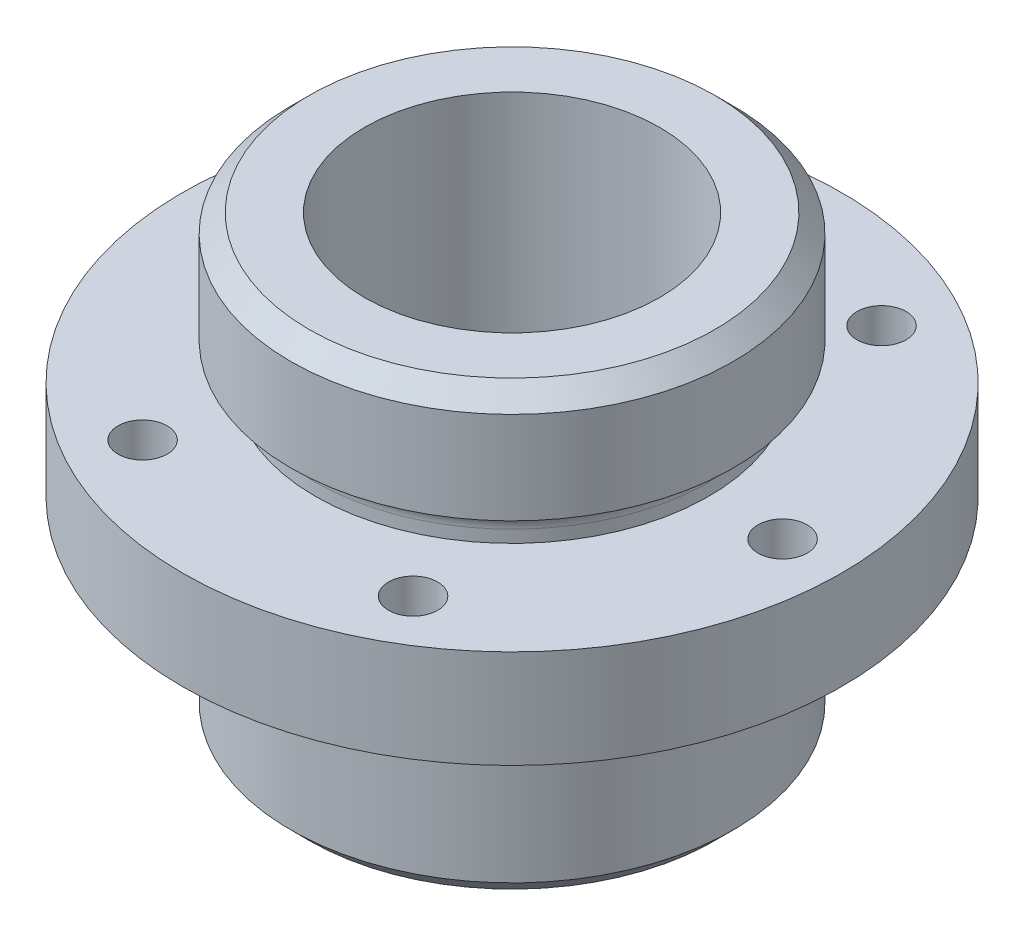
ISO-10303-21;
HEADER;
FILE_DESCRIPTION(('STEP AP214'),'2;1');
FILE_NAME('part.step','',(''),(''),'','','');
FILE_SCHEMA(('AUTOMOTIVE_DESIGN { 1 0 10303 214 1 1 1 1 }'));
ENDSEC;
DATA;
#1=APPLICATION_CONTEXT('core data for automotive mechanical design processes');
#2=APPLICATION_PROTOCOL_DEFINITION('international standard','automotive_design',2000,#1);
#3=PRODUCT_CONTEXT('',#1,'mechanical');
#4=PRODUCT('Part','Part','',(#3));
#5=PRODUCT_RELATED_PRODUCT_CATEGORY('part','',(#4));
#6=PRODUCT_DEFINITION_FORMATION('','',#4);
#7=PRODUCT_DEFINITION_CONTEXT('part definition',#1,'design');
#8=PRODUCT_DEFINITION('design','',#6,#7);
#9=PRODUCT_DEFINITION_SHAPE('','',#8);
#10=(LENGTH_UNIT() NAMED_UNIT(*) SI_UNIT(.MILLI.,.METRE.));
#11=(NAMED_UNIT(*) PLANE_ANGLE_UNIT() SI_UNIT($,.RADIAN.));
#12=(NAMED_UNIT(*) SI_UNIT($,.STERADIAN.) SOLID_ANGLE_UNIT());
#13=UNCERTAINTY_MEASURE_WITH_UNIT(LENGTH_MEASURE(1.E-05),#10,'distance_accuracy_value','');
#14=(GEOMETRIC_REPRESENTATION_CONTEXT(3) GLOBAL_UNCERTAINTY_ASSIGNED_CONTEXT((#13)) GLOBAL_UNIT_ASSIGNED_CONTEXT((#10,
#11,#12)) REPRESENTATION_CONTEXT('',''));
#15=CARTESIAN_POINT('',(0.,0.,0.));
#16=DIRECTION('',(0.,0.,1.));
#17=DIRECTION('',(1.,0.,0.));
#18=AXIS2_PLACEMENT_3D('',#15,#16,#17);
#19=CARTESIAN_POINT('',(0.,16.,0.));
#20=DIRECTION('',(0.,1.,0.));
#21=DIRECTION('',(0.,0.,1.));
#22=AXIS2_PLACEMENT_3D('',#19,#20,#21);
#23=PLANE('',#22);
#24=CARTESIAN_POINT('',(0.,16.,0.));
#25=DIRECTION('',(0.,1.,0.));
#26=DIRECTION('',(0.,0.,1.));
#27=AXIS2_PLACEMENT_3D('',#24,#25,#26);
#28=CIRCLE('',#27,32.);
#29=CARTESIAN_POINT('',(0.,16.,32.));
#30=VERTEX_POINT('',#29);
#31=EDGE_CURVE('E78',#30,#30,#28,.T.);
#32=ORIENTED_EDGE('',*,*,#31,.F.);
#33=EDGE_LOOP('',(#32));
#34=FACE_BOUND('',#33,.T.);
#35=CARTESIAN_POINT('',(22.,16.,38.1051177665153));
#36=DIRECTION('',(0.,1.,0.));
#37=DIRECTION('',(0.,0.,1.));
#38=AXIS2_PLACEMENT_3D('',#35,#36,#37);
#39=CIRCLE('',#38,3.99999999999999);
#40=CARTESIAN_POINT('',(22.,16.,42.1051177665153));
#41=VERTEX_POINT('',#40);
#42=EDGE_CURVE('E116',#41,#41,#39,.T.);
#43=ORIENTED_EDGE('',*,*,#42,.F.);
#44=EDGE_LOOP('',(#43));
#45=FACE_BOUND('',#44,.T.);
#46=CARTESIAN_POINT('',(22.,16.,-38.1051177665153));
#47=DIRECTION('',(0.,1.,0.));
#48=DIRECTION('',(0.,0.,1.));
#49=AXIS2_PLACEMENT_3D('',#46,#47,#48);
#50=CIRCLE('',#49,3.99999999999999);
#51=CARTESIAN_POINT('',(22.,16.,-34.1051177665153));
#52=VERTEX_POINT('',#51);
#53=EDGE_CURVE('E100',#52,#52,#50,.T.);
#54=ORIENTED_EDGE('',*,*,#53,.F.);
#55=EDGE_LOOP('',(#54));
#56=FACE_BOUND('',#55,.T.);
#57=CARTESIAN_POINT('',(-44.,16.,0.));
#58=DIRECTION('',(0.,1.,0.));
#59=DIRECTION('',(0.,0.,1.));
#60=AXIS2_PLACEMENT_3D('',#57,#58,#59);
#61=CIRCLE('',#60,4.);
#62=CARTESIAN_POINT('',(-44.,16.,4.));
#63=VERTEX_POINT('',#62);
#64=EDGE_CURVE('E84',#63,#63,#61,.T.);
#65=ORIENTED_EDGE('',*,*,#64,.F.);
#66=EDGE_LOOP('',(#65));
#67=FACE_BOUND('',#66,.T.);
#68=CARTESIAN_POINT('',(0.,16.,0.));
#69=DIRECTION('',(0.,1.,0.));
#70=DIRECTION('',(0.,0.,1.));
#71=AXIS2_PLACEMENT_3D('',#68,#69,#70);
#72=CIRCLE('',#71,53.6143984930028);
#73=CARTESIAN_POINT('',(0.,16.,53.6143984930028));
#74=VERTEX_POINT('',#73);
#75=EDGE_CURVE('E83',#74,#74,#72,.T.);
#76=ORIENTED_EDGE('',*,*,#75,.T.);
#77=EDGE_LOOP('',(#76));
#78=FACE_BOUND('',#77,.T.);
#79=CARTESIAN_POINT('',(-22.,16.,-38.1051177665153));
#80=DIRECTION('',(0.,1.,0.));
#81=DIRECTION('',(0.,0.,1.));
#82=AXIS2_PLACEMENT_3D('',#79,#80,#81);
#83=CIRCLE('',#82,3.99999999999999);
#84=CARTESIAN_POINT('',(-22.,16.,-34.1051177665153));
#85=VERTEX_POINT('',#84);
#86=EDGE_CURVE('E92',#85,#85,#83,.T.);
#87=ORIENTED_EDGE('',*,*,#86,.F.);
#88=EDGE_LOOP('',(#87));
#89=FACE_BOUND('',#88,.T.);
#90=CARTESIAN_POINT('',(44.,16.,0.));
#91=DIRECTION('',(0.,1.,0.));
#92=DIRECTION('',(0.,0.,1.));
#93=AXIS2_PLACEMENT_3D('',#90,#91,#92);
#94=CIRCLE('',#93,4.);
#95=CARTESIAN_POINT('',(44.,16.,3.99999999999999));
#96=VERTEX_POINT('',#95);
#97=EDGE_CURVE('E108',#96,#96,#94,.T.);
#98=ORIENTED_EDGE('',*,*,#97,.F.);
#99=EDGE_LOOP('',(#98));
#100=FACE_BOUND('',#99,.T.);
#101=CARTESIAN_POINT('',(-22.,16.,38.1051177665153));
#102=DIRECTION('',(0.,1.,0.));
#103=DIRECTION('',(0.,0.,1.));
#104=AXIS2_PLACEMENT_3D('',#101,#102,#103);
#105=CIRCLE('',#104,3.99999999999999);
#106=CARTESIAN_POINT('',(-22.,16.,42.1051177665153));
#107=VERTEX_POINT('',#106);
#108=EDGE_CURVE('E124',#107,#107,#105,.T.);
#109=ORIENTED_EDGE('',*,*,#108,.F.);
#110=EDGE_LOOP('',(#109));
#111=FACE_BOUND('',#110,.T.);
#112=ADVANCED_FACE('F41',(#34,#45,#56,#67,#78,#89,#100,#111),#23,.T.);
#113=CARTESIAN_POINT('',(0.,0.,0.));
#114=DIRECTION('',(0.,1.,0.));
#115=DIRECTION('',(0.,0.,1.));
#116=AXIS2_PLACEMENT_3D('',#113,#114,#115);
#117=PLANE('',#116);
#118=CARTESIAN_POINT('',(0.,0.,0.));
#119=DIRECTION('',(0.,1.,0.));
#120=DIRECTION('',(0.,0.,1.));
#121=AXIS2_PLACEMENT_3D('',#118,#119,#120);
#122=CIRCLE('',#121,32.);
#123=CARTESIAN_POINT('',(0.,0.,32.));
#124=VERTEX_POINT('',#123);
#125=EDGE_CURVE('E74',#124,#124,#122,.F.);
#126=ORIENTED_EDGE('',*,*,#125,.F.);
#127=EDGE_LOOP('',(#126));
#128=FACE_BOUND('',#127,.T.);
#129=CARTESIAN_POINT('',(0.,0.,0.));
#130=DIRECTION('',(0.,1.,0.));
#131=DIRECTION('',(0.,0.,1.));
#132=AXIS2_PLACEMENT_3D('',#129,#130,#131);
#133=CIRCLE('',#132,53.6143984930028);
#134=CARTESIAN_POINT('',(0.,0.,53.6143984930028));
#135=VERTEX_POINT('',#134);
#136=EDGE_CURVE('E79',#135,#135,#133,.T.);
#137=ORIENTED_EDGE('',*,*,#136,.F.);
#138=EDGE_LOOP('',(#137));
#139=FACE_BOUND('',#138,.T.);
#140=CARTESIAN_POINT('',(-44.,0.,0.));
#141=DIRECTION('',(0.,1.,0.));
#142=DIRECTION('',(0.,0.,1.));
#143=AXIS2_PLACEMENT_3D('',#140,#141,#142);
#144=CIRCLE('',#143,4.);
#145=CARTESIAN_POINT('',(-44.,0.,4.));
#146=VERTEX_POINT('',#145);
#147=EDGE_CURVE('E88',#146,#146,#144,.T.);
#148=ORIENTED_EDGE('',*,*,#147,.T.);
#149=EDGE_LOOP('',(#148));
#150=FACE_BOUND('',#149,.T.);
#151=CARTESIAN_POINT('',(-22.,0.,-38.1051177665153));
#152=DIRECTION('',(0.,1.,0.));
#153=DIRECTION('',(0.,0.,1.));
#154=AXIS2_PLACEMENT_3D('',#151,#152,#153);
#155=CIRCLE('',#154,3.99999999999999);
#156=CARTESIAN_POINT('',(-22.,0.,-34.1051177665153));
#157=VERTEX_POINT('',#156);
#158=EDGE_CURVE('E96',#157,#157,#155,.T.);
#159=ORIENTED_EDGE('',*,*,#158,.T.);
#160=EDGE_LOOP('',(#159));
#161=FACE_BOUND('',#160,.T.);
#162=CARTESIAN_POINT('',(22.,0.,-38.1051177665153));
#163=DIRECTION('',(0.,1.,0.));
#164=DIRECTION('',(0.,0.,1.));
#165=AXIS2_PLACEMENT_3D('',#162,#163,#164);
#166=CIRCLE('',#165,3.99999999999999);
#167=CARTESIAN_POINT('',(22.,0.,-34.1051177665153));
#168=VERTEX_POINT('',#167);
#169=EDGE_CURVE('E104',#168,#168,#166,.T.);
#170=ORIENTED_EDGE('',*,*,#169,.T.);
#171=EDGE_LOOP('',(#170));
#172=FACE_BOUND('',#171,.T.);
#173=CARTESIAN_POINT('',(44.,0.,0.));
#174=DIRECTION('',(0.,1.,0.));
#175=DIRECTION('',(0.,0.,1.));
#176=AXIS2_PLACEMENT_3D('',#173,#174,#175);
#177=CIRCLE('',#176,4.);
#178=CARTESIAN_POINT('',(44.,0.,3.99999999999999));
#179=VERTEX_POINT('',#178);
#180=EDGE_CURVE('E112',#179,#179,#177,.T.);
#181=ORIENTED_EDGE('',*,*,#180,.T.);
#182=EDGE_LOOP('',(#181));
#183=FACE_BOUND('',#182,.T.);
#184=CARTESIAN_POINT('',(22.,0.,38.1051177665153));
#185=DIRECTION('',(0.,1.,0.));
#186=DIRECTION('',(0.,0.,1.));
#187=AXIS2_PLACEMENT_3D('',#184,#185,#186);
#188=CIRCLE('',#187,3.99999999999999);
#189=CARTESIAN_POINT('',(22.,0.,42.1051177665153));
#190=VERTEX_POINT('',#189);
#191=EDGE_CURVE('E120',#190,#190,#188,.T.);
#192=ORIENTED_EDGE('',*,*,#191,.T.);
#193=EDGE_LOOP('',(#192));
#194=FACE_BOUND('',#193,.T.);
#195=CARTESIAN_POINT('',(-22.,0.,38.1051177665153));
#196=DIRECTION('',(0.,1.,0.));
#197=DIRECTION('',(0.,0.,1.));
#198=AXIS2_PLACEMENT_3D('',#195,#196,#197);
#199=CIRCLE('',#198,3.99999999999999);
#200=CARTESIAN_POINT('',(-22.,0.,42.1051177665153));
#201=VERTEX_POINT('',#200);
#202=EDGE_CURVE('E128',#201,#201,#199,.T.);
#203=ORIENTED_EDGE('',*,*,#202,.T.);
#204=EDGE_LOOP('',(#203));
#205=FACE_BOUND('',#204,.T.);
#206=ADVANCED_FACE('F173',(#128,#139,#150,#161,#172,#183,#194,#205),#117,.F.);
#207=CARTESIAN_POINT('',(0.,16.,0.));
#208=DIRECTION('',(0.,-1.,0.));
#209=DIRECTION('',(0.,0.,-1.));
#210=AXIS2_PLACEMENT_3D('',#207,#208,#209);
#211=CYLINDRICAL_SURFACE('',#210,53.6143984930028);
#212=ORIENTED_EDGE('',*,*,#75,.F.);
#213=EDGE_LOOP('',(#212));
#214=FACE_BOUND('',#213,.T.);
#215=ORIENTED_EDGE('',*,*,#136,.T.);
#216=EDGE_LOOP('',(#215));
#217=FACE_BOUND('',#216,.T.);
#218=ADVANCED_FACE('F179',(#214,#217),#211,.T.);
#219=CARTESIAN_POINT('',(-44.,16.,0.));
#220=DIRECTION('',(0.,-1.,0.));
#221=DIRECTION('',(0.,0.,-1.));
#222=AXIS2_PLACEMENT_3D('',#219,#220,#221);
#223=CYLINDRICAL_SURFACE('',#222,4.);
#224=ORIENTED_EDGE('',*,*,#64,.T.);
#225=EDGE_LOOP('',(#224));
#226=FACE_BOUND('',#225,.T.);
#227=ORIENTED_EDGE('',*,*,#147,.F.);
#228=EDGE_LOOP('',(#227));
#229=FACE_BOUND('',#228,.T.);
#230=ADVANCED_FACE('F185',(#226,#229),#223,.F.);
#231=CARTESIAN_POINT('',(-22.,16.,-38.1051177665153));
#232=DIRECTION('',(0.,-1.,0.));
#233=DIRECTION('',(0.,0.,-1.));
#234=AXIS2_PLACEMENT_3D('',#231,#232,#233);
#235=CYLINDRICAL_SURFACE('',#234,3.99999999999999);
#236=ORIENTED_EDGE('',*,*,#86,.T.);
#237=EDGE_LOOP('',(#236));
#238=FACE_BOUND('',#237,.T.);
#239=ORIENTED_EDGE('',*,*,#158,.F.);
#240=EDGE_LOOP('',(#239));
#241=FACE_BOUND('',#240,.T.);
#242=ADVANCED_FACE('F339',(#238,#241),#235,.F.);
#243=CARTESIAN_POINT('',(22.,16.,-38.1051177665153));
#244=DIRECTION('',(0.,-1.,0.));
#245=DIRECTION('',(0.,0.,-1.));
#246=AXIS2_PLACEMENT_3D('',#243,#244,#245);
#247=CYLINDRICAL_SURFACE('',#246,3.99999999999999);
#248=ORIENTED_EDGE('',*,*,#53,.T.);
#249=EDGE_LOOP('',(#248));
#250=FACE_BOUND('',#249,.T.);
#251=ORIENTED_EDGE('',*,*,#169,.F.);
#252=EDGE_LOOP('',(#251));
#253=FACE_BOUND('',#252,.T.);
#254=ADVANCED_FACE('F328',(#250,#253),#247,.F.);
#255=CARTESIAN_POINT('',(44.,16.,0.));
#256=DIRECTION('',(0.,-1.,0.));
#257=DIRECTION('',(0.,0.,-1.));
#258=AXIS2_PLACEMENT_3D('',#255,#256,#257);
#259=CYLINDRICAL_SURFACE('',#258,4.);
#260=ORIENTED_EDGE('',*,*,#97,.T.);
#261=EDGE_LOOP('',(#260));
#262=FACE_BOUND('',#261,.T.);
#263=ORIENTED_EDGE('',*,*,#180,.F.);
#264=EDGE_LOOP('',(#263));
#265=FACE_BOUND('',#264,.T.);
#266=ADVANCED_FACE('F317',(#262,#265),#259,.F.);
#267=CARTESIAN_POINT('',(22.,16.,38.1051177665153));
#268=DIRECTION('',(0.,-1.,0.));
#269=DIRECTION('',(0.,0.,-1.));
#270=AXIS2_PLACEMENT_3D('',#267,#268,#269);
#271=CYLINDRICAL_SURFACE('',#270,3.99999999999999);
#272=ORIENTED_EDGE('',*,*,#42,.T.);
#273=EDGE_LOOP('',(#272));
#274=FACE_BOUND('',#273,.T.);
#275=ORIENTED_EDGE('',*,*,#191,.F.);
#276=EDGE_LOOP('',(#275));
#277=FACE_BOUND('',#276,.T.);
#278=ADVANCED_FACE('F305',(#274,#277),#271,.F.);
#279=CARTESIAN_POINT('',(-22.,16.,38.1051177665153));
#280=DIRECTION('',(0.,-1.,0.));
#281=DIRECTION('',(0.,0.,-1.));
#282=AXIS2_PLACEMENT_3D('',#279,#280,#281);
#283=CYLINDRICAL_SURFACE('',#282,3.99999999999999);
#284=ORIENTED_EDGE('',*,*,#108,.T.);
#285=EDGE_LOOP('',(#284));
#286=FACE_BOUND('',#285,.T.);
#287=ORIENTED_EDGE('',*,*,#202,.F.);
#288=EDGE_LOOP('',(#287));
#289=FACE_BOUND('',#288,.T.);
#290=ADVANCED_FACE('F282',(#286,#289),#283,.F.);
#291=CARTESIAN_POINT('',(0.,22.,0.));
#292=DIRECTION('',(0.,-1.,0.));
#293=DIRECTION('',(0.,0.,-1.));
#294=AXIS2_PLACEMENT_3D('',#291,#292,#293);
#295=CYLINDRICAL_SURFACE('',#294,32.);
#296=CARTESIAN_POINT('',(0.,18.,0.));
#297=DIRECTION('',(0.,1.,0.));
#298=DIRECTION('',(0.,0.,1.));
#299=AXIS2_PLACEMENT_3D('',#296,#297,#298);
#300=CIRCLE('',#299,32.);
#301=CARTESIAN_POINT('',(0.,18.,32.));
#302=VERTEX_POINT('',#301);
#303=EDGE_CURVE('E66',#302,#302,#300,.F.);
#304=ORIENTED_EDGE('',*,*,#303,.T.);
#305=EDGE_LOOP('',(#304));
#306=FACE_BOUND('',#305,.T.);
#307=ORIENTED_EDGE('',*,*,#31,.T.);
#308=EDGE_LOOP('',(#307));
#309=FACE_BOUND('',#308,.T.);
#310=ADVANCED_FACE('F170',(#306,#309),#295,.T.);
#311=CARTESIAN_POINT('',(0.,40.,0.));
#312=DIRECTION('',(0.,-1.,0.));
#313=DIRECTION('',(0.,0.,-1.));
#314=AXIS2_PLACEMENT_3D('',#311,#312,#313);
#315=CYLINDRICAL_SURFACE('',#314,36.);
#316=CARTESIAN_POINT('',(0.,37.,0.));
#317=DIRECTION('',(0.,1.,0.));
#318=DIRECTION('',(0.,0.,1.));
#319=AXIS2_PLACEMENT_3D('',#316,#317,#318);
#320=CIRCLE('',#319,36.);
#321=CARTESIAN_POINT('',(0.,37.,36.));
#322=VERTEX_POINT('',#321);
#323=EDGE_CURVE('E10',#322,#322,#320,.F.);
#324=ORIENTED_EDGE('',*,*,#323,.T.);
#325=EDGE_LOOP('',(#324));
#326=FACE_BOUND('',#325,.T.);
#327=CARTESIAN_POINT('',(0.,22.,0.));
#328=DIRECTION('',(0.,1.,0.));
#329=DIRECTION('',(0.,0.,1.));
#330=AXIS2_PLACEMENT_3D('',#327,#328,#329);
#331=CIRCLE('',#330,36.);
#332=CARTESIAN_POINT('',(0.,22.,36.));
#333=VERTEX_POINT('',#332);
#334=EDGE_CURVE('E132',#333,#333,#331,.T.);
#335=ORIENTED_EDGE('',*,*,#334,.T.);
#336=EDGE_LOOP('',(#335));
#337=FACE_BOUND('',#336,.T.);
#338=ADVANCED_FACE('F161',(#326,#337),#315,.T.);
#339=CARTESIAN_POINT('',(0.,40.,0.));
#340=DIRECTION('',(0.,1.,0.));
#341=DIRECTION('',(0.,0.,1.));
#342=AXIS2_PLACEMENT_3D('',#339,#340,#341);
#343=PLANE('',#342);
#344=CARTESIAN_POINT('',(0.,40.,0.));
#345=DIRECTION('',(0.,1.,0.));
#346=DIRECTION('',(0.,0.,1.));
#347=AXIS2_PLACEMENT_3D('',#344,#345,#346);
#348=CIRCLE('',#347,24.);
#349=CARTESIAN_POINT('',(0.,40.,24.));
#350=VERTEX_POINT('',#349);
#351=EDGE_CURVE('E150',#350,#350,#348,.T.);
#352=ORIENTED_EDGE('',*,*,#351,.F.);
#353=EDGE_LOOP('',(#352));
#354=FACE_BOUND('',#353,.T.);
#355=CARTESIAN_POINT('',(0.,40.,0.));
#356=DIRECTION('',(0.,1.,0.));
#357=DIRECTION('',(0.,0.,1.));
#358=AXIS2_PLACEMENT_3D('',#355,#356,#357);
#359=CIRCLE('',#358,33.);
#360=CARTESIAN_POINT('',(0.,40.,33.));
#361=VERTEX_POINT('',#360);
#362=EDGE_CURVE('E50',#361,#361,#359,.T.);
#363=ORIENTED_EDGE('',*,*,#362,.T.);
#364=EDGE_LOOP('',(#363));
#365=FACE_BOUND('',#364,.T.);
#366=ADVANCED_FACE('F158',(#354,#365),#343,.T.);
#367=CARTESIAN_POINT('',(0.,-8.,0.));
#368=DIRECTION('',(0.,1.,0.));
#369=DIRECTION('',(0.,0.,1.));
#370=AXIS2_PLACEMENT_3D('',#367,#368,#369);
#371=CYLINDRICAL_SURFACE('',#370,32.);
#372=CARTESIAN_POINT('',(0.,-4.,0.));
#373=DIRECTION('',(0.,-1.,0.));
#374=DIRECTION('',(0.,0.,-1.));
#375=AXIS2_PLACEMENT_3D('',#372,#373,#374);
#376=CIRCLE('',#375,32.);
#377=CARTESIAN_POINT('',(0.,-4.,-32.));
#378=VERTEX_POINT('',#377);
#379=EDGE_CURVE('E70',#378,#378,#376,.F.);
#380=ORIENTED_EDGE('',*,*,#379,.T.);
#381=EDGE_LOOP('',(#380));
#382=FACE_BOUND('',#381,.T.);
#383=ORIENTED_EDGE('',*,*,#125,.T.);
#384=EDGE_LOOP('',(#383));
#385=FACE_BOUND('',#384,.T.);
#386=ADVANCED_FACE('F160',(#382,#385),#371,.T.);
#387=CARTESIAN_POINT('',(0.,-32.,0.));
#388=DIRECTION('',(0.,1.,0.));
#389=DIRECTION('',(0.,0.,1.));
#390=AXIS2_PLACEMENT_3D('',#387,#388,#389);
#391=CYLINDRICAL_SURFACE('',#390,36.);
#392=CARTESIAN_POINT('',(0.,-29.,0.));
#393=DIRECTION('',(0.,-1.,0.));
#394=DIRECTION('',(0.,0.,-1.));
#395=AXIS2_PLACEMENT_3D('',#392,#393,#394);
#396=CIRCLE('',#395,36.);
#397=CARTESIAN_POINT('',(0.,-29.,-36.));
#398=VERTEX_POINT('',#397);
#399=EDGE_CURVE('E55',#398,#398,#396,.F.);
#400=ORIENTED_EDGE('',*,*,#399,.T.);
#401=EDGE_LOOP('',(#400));
#402=FACE_BOUND('',#401,.T.);
#403=CARTESIAN_POINT('',(0.,-8.,0.));
#404=DIRECTION('',(0.,-1.,0.));
#405=DIRECTION('',(0.,0.,-1.));
#406=AXIS2_PLACEMENT_3D('',#403,#404,#405);
#407=CIRCLE('',#406,36.);
#408=CARTESIAN_POINT('',(0.,-8.,-36.));
#409=VERTEX_POINT('',#408);
#410=EDGE_CURVE('E142',#409,#409,#407,.T.);
#411=ORIENTED_EDGE('',*,*,#410,.T.);
#412=EDGE_LOOP('',(#411));
#413=FACE_BOUND('',#412,.T.);
#414=ADVANCED_FACE('F167',(#402,#413),#391,.T.);
#415=CARTESIAN_POINT('',(0.,-32.,0.));
#416=DIRECTION('',(0.,-1.,0.));
#417=DIRECTION('',(0.,0.,-1.));
#418=AXIS2_PLACEMENT_3D('',#415,#416,#417);
#419=PLANE('',#418);
#420=CARTESIAN_POINT('',(0.,-32.,0.));
#421=DIRECTION('',(0.,-1.,0.));
#422=DIRECTION('',(0.,0.,-1.));
#423=AXIS2_PLACEMENT_3D('',#420,#421,#422);
#424=CIRCLE('',#423,24.);
#425=CARTESIAN_POINT('',(0.,-32.,-24.));
#426=VERTEX_POINT('',#425);
#427=EDGE_CURVE('E146',#426,#426,#424,.F.);
#428=ORIENTED_EDGE('',*,*,#427,.T.);
#429=EDGE_LOOP('',(#428));
#430=FACE_BOUND('',#429,.T.);
#431=CARTESIAN_POINT('',(0.,-32.,0.));
#432=DIRECTION('',(0.,-1.,0.));
#433=DIRECTION('',(0.,0.,-1.));
#434=AXIS2_PLACEMENT_3D('',#431,#432,#433);
#435=CIRCLE('',#434,33.);
#436=CARTESIAN_POINT('',(0.,-32.,-33.));
#437=VERTEX_POINT('',#436);
#438=EDGE_CURVE('E60',#437,#437,#435,.T.);
#439=ORIENTED_EDGE('',*,*,#438,.T.);
#440=EDGE_LOOP('',(#439));
#441=FACE_BOUND('',#440,.T.);
#442=ADVANCED_FACE('F195',(#430,#441),#419,.T.);
#443=CARTESIAN_POINT('',(0.,-4.,0.));
#444=DIRECTION('',(0.,-1.,0.));
#445=DIRECTION('',(0.,0.,-1.));
#446=AXIS2_PLACEMENT_3D('',#443,#444,#445);
#447=TOROIDAL_SURFACE('',#446,36.,4.);
#448=ORIENTED_EDGE('',*,*,#379,.F.);
#449=EDGE_LOOP('',(#448));
#450=FACE_BOUND('',#449,.T.);
#451=ORIENTED_EDGE('',*,*,#410,.F.);
#452=EDGE_LOOP('',(#451));
#453=FACE_BOUND('',#452,.T.);
#454=ADVANCED_FACE('F191',(#450,#453),#447,.F.);
#455=CARTESIAN_POINT('',(0.,18.,0.));
#456=DIRECTION('',(0.,1.,0.));
#457=DIRECTION('',(0.,0.,1.));
#458=AXIS2_PLACEMENT_3D('',#455,#456,#457);
#459=TOROIDAL_SURFACE('',#458,36.,4.);
#460=ORIENTED_EDGE('',*,*,#303,.F.);
#461=EDGE_LOOP('',(#460));
#462=FACE_BOUND('',#461,.T.);
#463=ORIENTED_EDGE('',*,*,#334,.F.);
#464=EDGE_LOOP('',(#463));
#465=FACE_BOUND('',#464,.T.);
#466=ADVANCED_FACE('F194',(#462,#465),#459,.F.);
#467=CARTESIAN_POINT('',(0.,-32.,0.));
#468=DIRECTION('',(0.,1.,0.));
#469=DIRECTION('',(0.,0.,1.));
#470=AXIS2_PLACEMENT_3D('',#467,#468,#469);
#471=CONICAL_SURFACE('',#470,33.,0.785398163397441);
#472=ORIENTED_EDGE('',*,*,#399,.F.);
#473=EDGE_LOOP('',(#472));
#474=FACE_BOUND('',#473,.T.);
#475=ORIENTED_EDGE('',*,*,#438,.F.);
#476=EDGE_LOOP('',(#475));
#477=FACE_BOUND('',#476,.T.);
#478=ADVANCED_FACE('F198',(#474,#477),#471,.T.);
#479=CARTESIAN_POINT('',(0.,40.,0.));
#480=DIRECTION('',(0.,-1.,0.));
#481=DIRECTION('',(0.,0.,-1.));
#482=AXIS2_PLACEMENT_3D('',#479,#480,#481);
#483=CONICAL_SURFACE('',#482,33.,0.785398163397441);
#484=ORIENTED_EDGE('',*,*,#323,.F.);
#485=EDGE_LOOP('',(#484));
#486=FACE_BOUND('',#485,.T.);
#487=ORIENTED_EDGE('',*,*,#362,.F.);
#488=EDGE_LOOP('',(#487));
#489=FACE_BOUND('',#488,.T.);
#490=ADVANCED_FACE('F44',(#486,#489),#483,.T.);
#491=CARTESIAN_POINT('',(0.,-99.8822509939086,0.));
#492=DIRECTION('',(0.,1.,0.));
#493=DIRECTION('',(0.,0.,1.));
#494=AXIS2_PLACEMENT_3D('',#491,#492,#493);
#495=CYLINDRICAL_SURFACE('',#494,24.);
#496=ORIENTED_EDGE('',*,*,#351,.T.);
#497=EDGE_LOOP('',(#496));
#498=FACE_BOUND('',#497,.T.);
#499=ORIENTED_EDGE('',*,*,#427,.F.);
#500=EDGE_LOOP('',(#499));
#501=FACE_BOUND('',#500,.T.);
#502=ADVANCED_FACE('F155',(#498,#501),#495,.F.);
#503=CLOSED_SHELL('',(#112,#206,#218,#230,#242,#254,#266,#278,#290,#310,#338,#366,#386,#414,
#442,#454,#466,#478,#490,#502));
#504=MANIFOLD_SOLID_BREP('B2',#503);
#505=ADVANCED_BREP_SHAPE_REPRESENTATION('',(#18,#504),#14);
#506=SHAPE_DEFINITION_REPRESENTATION(#9,#505);
ENDSEC;
END-ISO-10303-21;
